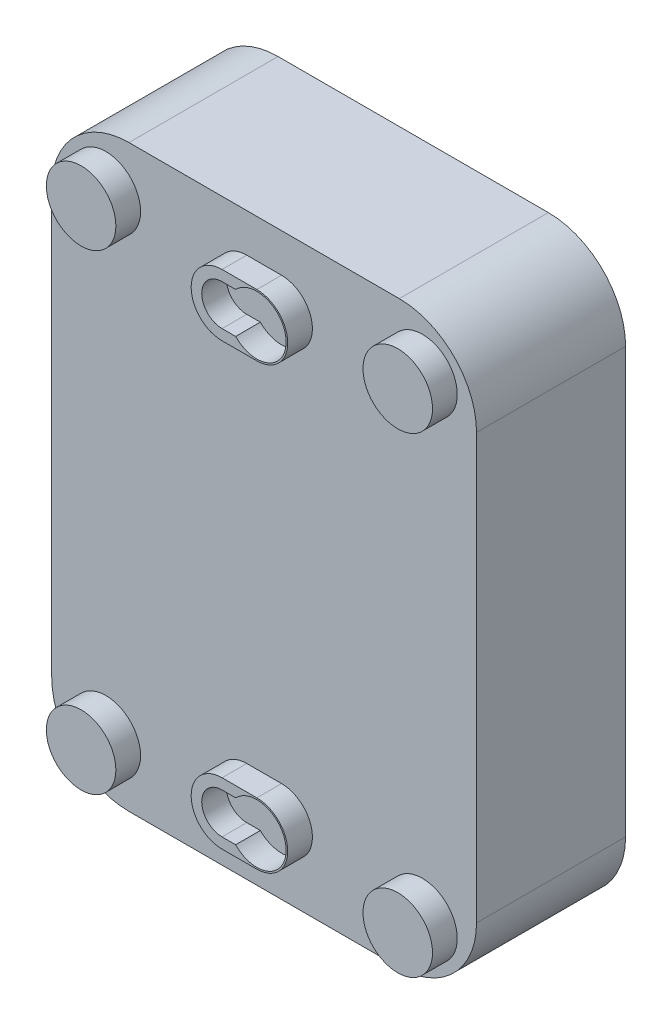
ISO-10303-21;
HEADER;
FILE_DESCRIPTION(('STEP AP214'),'2;1');
FILE_NAME('part.step','',(''),(''),'','','');
FILE_SCHEMA(('AUTOMOTIVE_DESIGN { 1 0 10303 214 1 1 1 1 }'));
ENDSEC;
DATA;
#1=APPLICATION_CONTEXT('core data for automotive mechanical design processes');
#2=APPLICATION_PROTOCOL_DEFINITION('international standard','automotive_design',2000,#1);
#3=PRODUCT_CONTEXT('',#1,'mechanical');
#4=PRODUCT('Part','Part','',(#3));
#5=PRODUCT_RELATED_PRODUCT_CATEGORY('part','',(#4));
#6=PRODUCT_DEFINITION_FORMATION('','',#4);
#7=PRODUCT_DEFINITION_CONTEXT('part definition',#1,'design');
#8=PRODUCT_DEFINITION('design','',#6,#7);
#9=PRODUCT_DEFINITION_SHAPE('','',#8);
#10=(LENGTH_UNIT() NAMED_UNIT(*) SI_UNIT(.MILLI.,.METRE.));
#11=(NAMED_UNIT(*) PLANE_ANGLE_UNIT() SI_UNIT($,.RADIAN.));
#12=(NAMED_UNIT(*) SI_UNIT($,.STERADIAN.) SOLID_ANGLE_UNIT());
#13=UNCERTAINTY_MEASURE_WITH_UNIT(LENGTH_MEASURE(1.E-05),#10,'distance_accuracy_value','');
#14=(GEOMETRIC_REPRESENTATION_CONTEXT(3) GLOBAL_UNCERTAINTY_ASSIGNED_CONTEXT((#13)) GLOBAL_UNIT_ASSIGNED_CONTEXT((#10,
#11,#12)) REPRESENTATION_CONTEXT('',''));
#15=CARTESIAN_POINT('',(0.,0.,0.));
#16=DIRECTION('',(0.,0.,1.));
#17=DIRECTION('',(1.,0.,0.));
#18=AXIS2_PLACEMENT_3D('',#15,#16,#17);
#19=CARTESIAN_POINT('',(0.,0.,28.575));
#20=DIRECTION('',(1.,0.,0.));
#21=DIRECTION('',(0.,1.,0.));
#22=AXIS2_PLACEMENT_3D('',#19,#20,#21);
#23=PLANE('',#22);
#24=DIRECTION('',(0.,-1.,0.));
#25=VECTOR('',#24,1.);
#26=CARTESIAN_POINT('',(0.,0.,24.511));
#27=LINE('',#26,#25);
#28=CARTESIAN_POINT('',(0.,82.55,24.511));
#29=VERTEX_POINT('',#28);
#30=CARTESIAN_POINT('',(0.,12.7,24.511));
#31=VERTEX_POINT('',#30);
#32=EDGE_CURVE('E361',#29,#31,#27,.T.);
#33=ORIENTED_EDGE('',*,*,#32,.F.);
#34=DIRECTION('',(0.,0.,-1.));
#35=VECTOR('',#34,1.);
#36=CARTESIAN_POINT('',(0.,82.55,28.575));
#37=LINE('',#36,#35);
#38=CARTESIAN_POINT('',(0.,82.55,0.));
#39=VERTEX_POINT('',#38);
#40=EDGE_CURVE('E401',#29,#39,#37,.T.);
#41=ORIENTED_EDGE('',*,*,#40,.T.);
#42=DIRECTION('',(0.,-1.,0.));
#43=VECTOR('',#42,1.);
#44=CARTESIAN_POINT('',(0.,0.,0.));
#45=LINE('',#44,#43);
#46=CARTESIAN_POINT('',(0.,12.7,0.));
#47=VERTEX_POINT('',#46);
#48=EDGE_CURVE('E376',#39,#47,#45,.T.);
#49=ORIENTED_EDGE('',*,*,#48,.T.);
#50=DIRECTION('',(0.,0.,-1.));
#51=VECTOR('',#50,1.);
#52=CARTESIAN_POINT('',(0.,12.7,28.575));
#53=LINE('',#52,#51);
#54=EDGE_CURVE('E403',#47,#31,#53,.F.);
#55=ORIENTED_EDGE('',*,*,#54,.T.);
#56=EDGE_LOOP('',(#33,#41,#49,#55));
#57=FACE_BOUND('',#56,.T.);
#58=ADVANCED_FACE('F37',(#57),#23,.F.);
#59=CARTESIAN_POINT('',(0.,0.,28.575));
#60=DIRECTION('',(0.,1.,0.));
#61=DIRECTION('',(0.,0.,1.));
#62=AXIS2_PLACEMENT_3D('',#59,#60,#61);
#63=PLANE('',#62);
#64=DIRECTION('',(1.,0.,0.));
#65=VECTOR('',#64,1.);
#66=CARTESIAN_POINT('',(0.,0.,24.511));
#67=LINE('',#66,#65);
#68=CARTESIAN_POINT('',(12.7,0.,24.511));
#69=VERTEX_POINT('',#68);
#70=CARTESIAN_POINT('',(57.15,0.,24.511));
#71=VERTEX_POINT('',#70);
#72=EDGE_CURVE('E371',#69,#71,#67,.T.);
#73=ORIENTED_EDGE('',*,*,#72,.F.);
#74=DIRECTION('',(0.,0.,-1.));
#75=VECTOR('',#74,1.);
#76=CARTESIAN_POINT('',(12.7,0.,28.575));
#77=LINE('',#76,#75);
#78=CARTESIAN_POINT('',(12.7,0.,0.));
#79=VERTEX_POINT('',#78);
#80=EDGE_CURVE('E391',#69,#79,#77,.T.);
#81=ORIENTED_EDGE('',*,*,#80,.T.);
#82=DIRECTION('',(1.,0.,0.));
#83=VECTOR('',#82,1.);
#84=CARTESIAN_POINT('',(0.,0.,0.));
#85=LINE('',#84,#83);
#86=CARTESIAN_POINT('',(57.15,0.,0.));
#87=VERTEX_POINT('',#86);
#88=EDGE_CURVE('E379',#79,#87,#85,.T.);
#89=ORIENTED_EDGE('',*,*,#88,.T.);
#90=DIRECTION('',(0.,0.,-1.));
#91=VECTOR('',#90,1.);
#92=CARTESIAN_POINT('',(57.15,0.,28.575));
#93=LINE('',#92,#91);
#94=EDGE_CURVE('E388',#87,#71,#93,.F.);
#95=ORIENTED_EDGE('',*,*,#94,.T.);
#96=EDGE_LOOP('',(#73,#81,#89,#95));
#97=FACE_BOUND('',#96,.T.);
#98=ADVANCED_FACE('F441',(#97),#63,.F.);
#99=CARTESIAN_POINT('',(69.85,0.,28.575));
#100=DIRECTION('',(-1.,0.,0.));
#101=DIRECTION('',(0.,-1.,0.));
#102=AXIS2_PLACEMENT_3D('',#99,#100,#101);
#103=PLANE('',#102);
#104=DIRECTION('',(0.,1.,0.));
#105=VECTOR('',#104,1.);
#106=CARTESIAN_POINT('',(69.85,0.,24.511));
#107=LINE('',#106,#105);
#108=CARTESIAN_POINT('',(69.85,12.7,24.511));
#109=VERTEX_POINT('',#108);
#110=CARTESIAN_POINT('',(69.85,82.55,24.511));
#111=VERTEX_POINT('',#110);
#112=EDGE_CURVE('E369',#109,#111,#107,.T.);
#113=ORIENTED_EDGE('',*,*,#112,.F.);
#114=DIRECTION('',(0.,0.,-1.));
#115=VECTOR('',#114,1.);
#116=CARTESIAN_POINT('',(69.85,12.7,28.575));
#117=LINE('',#116,#115);
#118=CARTESIAN_POINT('',(69.85,12.7,0.));
#119=VERTEX_POINT('',#118);
#120=EDGE_CURVE('E409',#109,#119,#117,.T.);
#121=ORIENTED_EDGE('',*,*,#120,.T.);
#122=DIRECTION('',(0.,1.,0.));
#123=VECTOR('',#122,1.);
#124=CARTESIAN_POINT('',(69.85,0.,0.));
#125=LINE('',#124,#123);
#126=CARTESIAN_POINT('',(69.85,82.55,0.));
#127=VERTEX_POINT('',#126);
#128=EDGE_CURVE('E382',#119,#127,#125,.T.);
#129=ORIENTED_EDGE('',*,*,#128,.T.);
#130=DIRECTION('',(0.,0.,-1.));
#131=VECTOR('',#130,1.);
#132=CARTESIAN_POINT('',(69.85,82.55,28.575));
#133=LINE('',#132,#131);
#134=EDGE_CURVE('E406',#127,#111,#133,.F.);
#135=ORIENTED_EDGE('',*,*,#134,.T.);
#136=EDGE_LOOP('',(#113,#121,#129,#135));
#137=FACE_BOUND('',#136,.T.);
#138=ADVANCED_FACE('F449',(#137),#103,.F.);
#139=CARTESIAN_POINT('',(0.,95.25,28.575));
#140=DIRECTION('',(0.,-1.,0.));
#141=DIRECTION('',(0.,0.,-1.));
#142=AXIS2_PLACEMENT_3D('',#139,#140,#141);
#143=PLANE('',#142);
#144=DIRECTION('',(-1.,0.,0.));
#145=VECTOR('',#144,1.);
#146=CARTESIAN_POINT('',(0.,95.25,24.511));
#147=LINE('',#146,#145);
#148=CARTESIAN_POINT('',(57.15,95.25,24.511));
#149=VERTEX_POINT('',#148);
#150=CARTESIAN_POINT('',(12.7,95.25,24.511));
#151=VERTEX_POINT('',#150);
#152=EDGE_CURVE('E353',#149,#151,#147,.T.);
#153=ORIENTED_EDGE('',*,*,#152,.F.);
#154=DIRECTION('',(0.,0.,-1.));
#155=VECTOR('',#154,1.);
#156=CARTESIAN_POINT('',(57.15,95.25,28.575));
#157=LINE('',#156,#155);
#158=CARTESIAN_POINT('',(57.15,95.25,0.));
#159=VERTEX_POINT('',#158);
#160=EDGE_CURVE('E45',#149,#159,#157,.T.);
#161=ORIENTED_EDGE('',*,*,#160,.T.);
#162=DIRECTION('',(-1.,0.,0.));
#163=VECTOR('',#162,1.);
#164=CARTESIAN_POINT('',(0.,95.25,0.));
#165=LINE('',#164,#163);
#166=CARTESIAN_POINT('',(12.7,95.25,0.));
#167=VERTEX_POINT('',#166);
#168=EDGE_CURVE('E385',#159,#167,#165,.T.);
#169=ORIENTED_EDGE('',*,*,#168,.T.);
#170=DIRECTION('',(0.,0.,-1.));
#171=VECTOR('',#170,1.);
#172=CARTESIAN_POINT('',(12.7,95.25,28.575));
#173=LINE('',#172,#171);
#174=EDGE_CURVE('E411',#167,#151,#173,.F.);
#175=ORIENTED_EDGE('',*,*,#174,.T.);
#176=EDGE_LOOP('',(#153,#161,#169,#175));
#177=FACE_BOUND('',#176,.T.);
#178=ADVANCED_FACE('F417',(#177),#143,.F.);
#179=CARTESIAN_POINT('',(12.7,12.7,28.575));
#180=DIRECTION('',(0.,0.,-1.));
#181=DIRECTION('',(-1.,0.,0.));
#182=AXIS2_PLACEMENT_3D('',#179,#180,#181);
#183=CYLINDRICAL_SURFACE('',#182,12.7);
#184=ORIENTED_EDGE('',*,*,#80,.F.);
#185=CARTESIAN_POINT('',(12.7,12.7,24.511));
#186=DIRECTION('',(0.,0.,1.));
#187=DIRECTION('',(1.,0.,0.));
#188=AXIS2_PLACEMENT_3D('',#185,#186,#187);
#189=CIRCLE('',#188,12.7);
#190=EDGE_CURVE('E366',#69,#31,#189,.F.);
#191=ORIENTED_EDGE('',*,*,#190,.T.);
#192=ORIENTED_EDGE('',*,*,#54,.F.);
#193=CARTESIAN_POINT('',(12.7,12.7,0.));
#194=DIRECTION('',(0.,0.,-1.));
#195=DIRECTION('',(-1.,0.,0.));
#196=AXIS2_PLACEMENT_3D('',#193,#194,#195);
#197=CIRCLE('',#196,12.7);
#198=EDGE_CURVE('E399',#79,#47,#197,.T.);
#199=ORIENTED_EDGE('',*,*,#198,.F.);
#200=EDGE_LOOP('',(#184,#191,#192,#199));
#201=FACE_BOUND('',#200,.T.);
#202=ADVANCED_FACE('F438',(#201),#183,.T.);
#203=CARTESIAN_POINT('',(57.15,12.7,28.575));
#204=DIRECTION('',(0.,0.,-1.));
#205=DIRECTION('',(-1.,0.,0.));
#206=AXIS2_PLACEMENT_3D('',#203,#204,#205);
#207=CYLINDRICAL_SURFACE('',#206,12.7);
#208=ORIENTED_EDGE('',*,*,#120,.F.);
#209=CARTESIAN_POINT('',(57.15,12.7,24.511));
#210=DIRECTION('',(0.,0.,1.));
#211=DIRECTION('',(1.,0.,0.));
#212=AXIS2_PLACEMENT_3D('',#209,#210,#211);
#213=CIRCLE('',#212,12.7);
#214=EDGE_CURVE('E373',#109,#71,#213,.F.);
#215=ORIENTED_EDGE('',*,*,#214,.T.);
#216=ORIENTED_EDGE('',*,*,#94,.F.);
#217=CARTESIAN_POINT('',(57.15,12.7,0.));
#218=DIRECTION('',(0.,0.,-1.));
#219=DIRECTION('',(-1.,0.,0.));
#220=AXIS2_PLACEMENT_3D('',#217,#218,#219);
#221=CIRCLE('',#220,12.7);
#222=EDGE_CURVE('E397',#119,#87,#221,.T.);
#223=ORIENTED_EDGE('',*,*,#222,.F.);
#224=EDGE_LOOP('',(#208,#215,#216,#223));
#225=FACE_BOUND('',#224,.T.);
#226=ADVANCED_FACE('F446',(#225),#207,.T.);
#227=CARTESIAN_POINT('',(57.15,82.55,28.575));
#228=DIRECTION('',(0.,0.,-1.));
#229=DIRECTION('',(-1.,0.,0.));
#230=AXIS2_PLACEMENT_3D('',#227,#228,#229);
#231=CYLINDRICAL_SURFACE('',#230,12.7);
#232=ORIENTED_EDGE('',*,*,#160,.F.);
#233=CARTESIAN_POINT('',(57.15,82.55,24.511));
#234=DIRECTION('',(0.,0.,1.));
#235=DIRECTION('',(1.,0.,0.));
#236=AXIS2_PLACEMENT_3D('',#233,#234,#235);
#237=CIRCLE('',#236,12.7);
#238=EDGE_CURVE('E363',#149,#111,#237,.F.);
#239=ORIENTED_EDGE('',*,*,#238,.T.);
#240=ORIENTED_EDGE('',*,*,#134,.F.);
#241=CARTESIAN_POINT('',(57.15,82.55,0.));
#242=DIRECTION('',(0.,0.,-1.));
#243=DIRECTION('',(-1.,0.,0.));
#244=AXIS2_PLACEMENT_3D('',#241,#242,#243);
#245=CIRCLE('',#244,12.7);
#246=EDGE_CURVE('E395',#159,#127,#245,.T.);
#247=ORIENTED_EDGE('',*,*,#246,.F.);
#248=EDGE_LOOP('',(#232,#239,#240,#247));
#249=FACE_BOUND('',#248,.T.);
#250=ADVANCED_FACE('F422',(#249),#231,.T.);
#251=CARTESIAN_POINT('',(12.7,82.55,28.575));
#252=DIRECTION('',(0.,0.,-1.));
#253=DIRECTION('',(-1.,0.,0.));
#254=AXIS2_PLACEMENT_3D('',#251,#252,#253);
#255=CYLINDRICAL_SURFACE('',#254,12.7);
#256=ORIENTED_EDGE('',*,*,#40,.F.);
#257=CARTESIAN_POINT('',(12.7,82.55,24.511));
#258=DIRECTION('',(0.,0.,1.));
#259=DIRECTION('',(1.,0.,0.));
#260=AXIS2_PLACEMENT_3D('',#257,#258,#259);
#261=CIRCLE('',#260,12.7);
#262=EDGE_CURVE('E12',#29,#151,#261,.F.);
#263=ORIENTED_EDGE('',*,*,#262,.T.);
#264=ORIENTED_EDGE('',*,*,#174,.F.);
#265=CARTESIAN_POINT('',(12.7,82.55,0.));
#266=DIRECTION('',(0.,0.,-1.));
#267=DIRECTION('',(-1.,0.,0.));
#268=AXIS2_PLACEMENT_3D('',#265,#266,#267);
#269=CIRCLE('',#268,12.7);
#270=EDGE_CURVE('E393',#39,#167,#269,.T.);
#271=ORIENTED_EDGE('',*,*,#270,.F.);
#272=EDGE_LOOP('',(#256,#263,#264,#271));
#273=FACE_BOUND('',#272,.T.);
#274=ADVANCED_FACE('F39',(#273),#255,.T.);
#275=CARTESIAN_POINT('',(0.,0.,0.));
#276=DIRECTION('',(0.,0.,-1.));
#277=DIRECTION('',(-1.,0.,0.));
#278=AXIS2_PLACEMENT_3D('',#275,#276,#277);
#279=PLANE('',#278);
#280=ORIENTED_EDGE('',*,*,#88,.F.);
#281=ORIENTED_EDGE('',*,*,#198,.T.);
#282=ORIENTED_EDGE('',*,*,#48,.F.);
#283=ORIENTED_EDGE('',*,*,#270,.T.);
#284=ORIENTED_EDGE('',*,*,#168,.F.);
#285=ORIENTED_EDGE('',*,*,#246,.T.);
#286=ORIENTED_EDGE('',*,*,#128,.F.);
#287=ORIENTED_EDGE('',*,*,#222,.T.);
#288=EDGE_LOOP('',(#280,#281,#282,#283,#284,#285,#286,#287));
#289=FACE_BOUND('',#288,.T.);
#290=ADVANCED_FACE('F426',(#289),#279,.T.);
#291=CARTESIAN_POINT('',(34.925,47.625,24.511));
#292=DIRECTION('',(0.,0.,1.));
#293=DIRECTION('',(1.,0.,0.));
#294=AXIS2_PLACEMENT_3D('',#291,#292,#293);
#295=PLANE('',#294);
#296=ORIENTED_EDGE('',*,*,#112,.T.);
#297=ORIENTED_EDGE('',*,*,#238,.F.);
#298=ORIENTED_EDGE('',*,*,#152,.T.);
#299=ORIENTED_EDGE('',*,*,#262,.F.);
#300=ORIENTED_EDGE('',*,*,#32,.T.);
#301=ORIENTED_EDGE('',*,*,#190,.F.);
#302=ORIENTED_EDGE('',*,*,#72,.T.);
#303=ORIENTED_EDGE('',*,*,#214,.F.);
#304=EDGE_LOOP('',(#296,#297,#298,#299,#300,#301,#302,#303));
#305=FACE_BOUND('',#304,.T.);
#306=DIRECTION('',(1.,0.,0.));
#307=VECTOR('',#306,1.);
#308=CARTESIAN_POINT('',(37.7825,78.74,24.511));
#309=LINE('',#308,#307);
#310=CARTESIAN_POINT('',(32.0675,78.74,24.511));
#311=VERTEX_POINT('',#310);
#312=CARTESIAN_POINT('',(37.7825,78.74,24.511));
#313=VERTEX_POINT('',#312);
#314=EDGE_CURVE('E211',#311,#313,#309,.T.);
#315=ORIENTED_EDGE('',*,*,#314,.F.);
#316=CARTESIAN_POINT('',(32.0675,83.82,24.511));
#317=DIRECTION('',(0.,0.,1.));
#318=DIRECTION('',(-1.,0.,0.));
#319=AXIS2_PLACEMENT_3D('',#316,#317,#318);
#320=CIRCLE('',#319,5.08);
#321=CARTESIAN_POINT('',(32.0675,88.9,24.511));
#322=VERTEX_POINT('',#321);
#323=EDGE_CURVE('E221',#322,#311,#320,.T.);
#324=ORIENTED_EDGE('',*,*,#323,.F.);
#325=DIRECTION('',(-1.,0.,0.));
#326=VECTOR('',#325,1.);
#327=CARTESIAN_POINT('',(37.7825,88.9,24.511));
#328=LINE('',#327,#326);
#329=CARTESIAN_POINT('',(37.7825,88.9,24.511));
#330=VERTEX_POINT('',#329);
#331=EDGE_CURVE('E203',#330,#322,#328,.T.);
#332=ORIENTED_EDGE('',*,*,#331,.F.);
#333=CARTESIAN_POINT('',(37.7825,83.82,24.511));
#334=DIRECTION('',(0.,0.,1.));
#335=DIRECTION('',(-1.,0.,0.));
#336=AXIS2_PLACEMENT_3D('',#333,#334,#335);
#337=CIRCLE('',#336,5.08);
#338=EDGE_CURVE('E218',#313,#330,#337,.T.);
#339=ORIENTED_EDGE('',*,*,#338,.F.);
#340=EDGE_LOOP('',(#315,#324,#332,#339));
#341=FACE_BOUND('',#340,.T.);
#342=DIRECTION('',(1.,0.,0.));
#343=VECTOR('',#342,1.);
#344=CARTESIAN_POINT('',(37.7825,6.35,24.511));
#345=LINE('',#344,#343);
#346=CARTESIAN_POINT('',(32.0675,6.35,24.511));
#347=VERTEX_POINT('',#346);
#348=CARTESIAN_POINT('',(37.7825,6.35,24.511));
#349=VERTEX_POINT('',#348);
#350=EDGE_CURVE('E254',#347,#349,#345,.T.);
#351=ORIENTED_EDGE('',*,*,#350,.F.);
#352=CARTESIAN_POINT('',(32.0675,11.43,24.511));
#353=DIRECTION('',(0.,0.,1.));
#354=DIRECTION('',(1.,0.,0.));
#355=AXIS2_PLACEMENT_3D('',#352,#353,#354);
#356=CIRCLE('',#355,5.08);
#357=CARTESIAN_POINT('',(32.0675,16.51,24.511));
#358=VERTEX_POINT('',#357);
#359=EDGE_CURVE('E251',#358,#347,#356,.T.);
#360=ORIENTED_EDGE('',*,*,#359,.F.);
#361=DIRECTION('',(-1.,0.,0.));
#362=VECTOR('',#361,1.);
#363=CARTESIAN_POINT('',(37.7825,16.51,24.511));
#364=LINE('',#363,#362);
#365=CARTESIAN_POINT('',(37.7825,16.51,24.511));
#366=VERTEX_POINT('',#365);
#367=EDGE_CURVE('E247',#366,#358,#364,.T.);
#368=ORIENTED_EDGE('',*,*,#367,.F.);
#369=CARTESIAN_POINT('',(37.7825,11.43,24.511));
#370=DIRECTION('',(0.,0.,1.));
#371=DIRECTION('',(1.,0.,0.));
#372=AXIS2_PLACEMENT_3D('',#369,#370,#371);
#373=CIRCLE('',#372,5.08);
#374=EDGE_CURVE('E244',#349,#366,#373,.T.);
#375=ORIENTED_EDGE('',*,*,#374,.F.);
#376=EDGE_LOOP('',(#351,#360,#368,#375));
#377=FACE_BOUND('',#376,.T.);
#378=CARTESIAN_POINT('',(60.96,86.36,24.511));
#379=DIRECTION('',(0.,0.,1.));
#380=DIRECTION('',(1.,0.,0.));
#381=AXIS2_PLACEMENT_3D('',#378,#379,#380);
#382=CIRCLE('',#381,5.71499999999998);
#383=CARTESIAN_POINT('',(66.675,86.36,24.511));
#384=VERTEX_POINT('',#383);
#385=EDGE_CURVE('E274',#384,#384,#382,.T.);
#386=ORIENTED_EDGE('',*,*,#385,.F.);
#387=EDGE_LOOP('',(#386));
#388=FACE_BOUND('',#387,.T.);
#389=CARTESIAN_POINT('',(8.88999999999997,86.36,24.511));
#390=DIRECTION('',(0.,0.,1.));
#391=DIRECTION('',(1.,0.,0.));
#392=AXIS2_PLACEMENT_3D('',#389,#390,#391);
#393=CIRCLE('',#392,5.715);
#394=CARTESIAN_POINT('',(14.605,86.36,24.511));
#395=VERTEX_POINT('',#394);
#396=EDGE_CURVE('E280',#395,#395,#393,.T.);
#397=ORIENTED_EDGE('',*,*,#396,.F.);
#398=EDGE_LOOP('',(#397));
#399=FACE_BOUND('',#398,.T.);
#400=CARTESIAN_POINT('',(8.88999999999997,8.89,24.511));
#401=DIRECTION('',(0.,0.,1.));
#402=DIRECTION('',(1.,0.,0.));
#403=AXIS2_PLACEMENT_3D('',#400,#401,#402);
#404=CIRCLE('',#403,5.715);
#405=CARTESIAN_POINT('',(14.605,8.89,24.511));
#406=VERTEX_POINT('',#405);
#407=EDGE_CURVE('E286',#406,#406,#404,.T.);
#408=ORIENTED_EDGE('',*,*,#407,.F.);
#409=EDGE_LOOP('',(#408));
#410=FACE_BOUND('',#409,.T.);
#411=CARTESIAN_POINT('',(60.96,8.89,24.511));
#412=DIRECTION('',(0.,0.,1.));
#413=DIRECTION('',(1.,0.,0.));
#414=AXIS2_PLACEMENT_3D('',#411,#412,#413);
#415=CIRCLE('',#414,5.71499999999999);
#416=CARTESIAN_POINT('',(66.675,8.89,24.511));
#417=VERTEX_POINT('',#416);
#418=EDGE_CURVE('E292',#417,#417,#415,.T.);
#419=ORIENTED_EDGE('',*,*,#418,.F.);
#420=EDGE_LOOP('',(#419));
#421=FACE_BOUND('',#420,.T.);
#422=ADVANCED_FACE('F216',(#305,#341,#377,#388,#399,#410,#421),#295,.T.);
#423=CARTESIAN_POINT('',(60.96,8.89,24.511));
#424=DIRECTION('',(0.,0.,1.));
#425=DIRECTION('',(1.,0.,0.));
#426=AXIS2_PLACEMENT_3D('',#423,#424,#425);
#427=CYLINDRICAL_SURFACE('',#426,5.71499999999999);
#428=ORIENTED_EDGE('',*,*,#418,.T.);
#429=EDGE_LOOP('',(#428));
#430=FACE_BOUND('',#429,.T.);
#431=CARTESIAN_POINT('',(60.96,8.89,28.575));
#432=DIRECTION('',(0.,0.,1.));
#433=DIRECTION('',(1.,0.,0.));
#434=AXIS2_PLACEMENT_3D('',#431,#432,#433);
#435=CIRCLE('',#434,5.71499999999999);
#436=CARTESIAN_POINT('',(66.675,8.89,28.575));
#437=VERTEX_POINT('',#436);
#438=EDGE_CURVE('E289',#437,#437,#435,.T.);
#439=ORIENTED_EDGE('',*,*,#438,.F.);
#440=EDGE_LOOP('',(#439));
#441=FACE_BOUND('',#440,.T.);
#442=ADVANCED_FACE('F477',(#430,#441),#427,.T.);
#443=CARTESIAN_POINT('',(8.88999999999997,8.89,24.511));
#444=DIRECTION('',(0.,0.,1.));
#445=DIRECTION('',(1.,0.,0.));
#446=AXIS2_PLACEMENT_3D('',#443,#444,#445);
#447=CYLINDRICAL_SURFACE('',#446,5.715);
#448=ORIENTED_EDGE('',*,*,#407,.T.);
#449=EDGE_LOOP('',(#448));
#450=FACE_BOUND('',#449,.T.);
#451=CARTESIAN_POINT('',(8.88999999999997,8.89,28.575));
#452=DIRECTION('',(0.,0.,1.));
#453=DIRECTION('',(1.,0.,0.));
#454=AXIS2_PLACEMENT_3D('',#451,#452,#453);
#455=CIRCLE('',#454,5.715);
#456=CARTESIAN_POINT('',(14.605,8.89,28.575));
#457=VERTEX_POINT('',#456);
#458=EDGE_CURVE('E283',#457,#457,#455,.T.);
#459=ORIENTED_EDGE('',*,*,#458,.F.);
#460=EDGE_LOOP('',(#459));
#461=FACE_BOUND('',#460,.T.);
#462=ADVANCED_FACE('F528',(#450,#461),#447,.T.);
#463=CARTESIAN_POINT('',(8.88999999999997,86.36,24.511));
#464=DIRECTION('',(0.,0.,1.));
#465=DIRECTION('',(1.,0.,0.));
#466=AXIS2_PLACEMENT_3D('',#463,#464,#465);
#467=CYLINDRICAL_SURFACE('',#466,5.715);
#468=ORIENTED_EDGE('',*,*,#396,.T.);
#469=EDGE_LOOP('',(#468));
#470=FACE_BOUND('',#469,.T.);
#471=CARTESIAN_POINT('',(8.88999999999997,86.36,28.575));
#472=DIRECTION('',(0.,0.,1.));
#473=DIRECTION('',(1.,0.,0.));
#474=AXIS2_PLACEMENT_3D('',#471,#472,#473);
#475=CIRCLE('',#474,5.715);
#476=CARTESIAN_POINT('',(14.605,86.36,28.575));
#477=VERTEX_POINT('',#476);
#478=EDGE_CURVE('E277',#477,#477,#475,.T.);
#479=ORIENTED_EDGE('',*,*,#478,.F.);
#480=EDGE_LOOP('',(#479));
#481=FACE_BOUND('',#480,.T.);
#482=ADVANCED_FACE('F532',(#470,#481),#467,.T.);
#483=CARTESIAN_POINT('',(60.96,86.36,24.511));
#484=DIRECTION('',(0.,0.,1.));
#485=DIRECTION('',(1.,0.,0.));
#486=AXIS2_PLACEMENT_3D('',#483,#484,#485);
#487=CYLINDRICAL_SURFACE('',#486,5.71499999999998);
#488=ORIENTED_EDGE('',*,*,#385,.T.);
#489=EDGE_LOOP('',(#488));
#490=FACE_BOUND('',#489,.T.);
#491=CARTESIAN_POINT('',(60.96,86.36,28.575));
#492=DIRECTION('',(0.,0.,1.));
#493=DIRECTION('',(1.,0.,0.));
#494=AXIS2_PLACEMENT_3D('',#491,#492,#493);
#495=CIRCLE('',#494,5.71499999999998);
#496=CARTESIAN_POINT('',(66.675,86.36,28.575));
#497=VERTEX_POINT('',#496);
#498=EDGE_CURVE('E268',#497,#497,#495,.T.);
#499=ORIENTED_EDGE('',*,*,#498,.F.);
#500=EDGE_LOOP('',(#499));
#501=FACE_BOUND('',#500,.T.);
#502=ADVANCED_FACE('F536',(#490,#501),#487,.T.);
#503=CARTESIAN_POINT('',(37.7825,11.43,24.511));
#504=DIRECTION('',(0.,0.,1.));
#505=DIRECTION('',(1.,0.,0.));
#506=AXIS2_PLACEMENT_3D('',#503,#504,#505);
#507=CYLINDRICAL_SURFACE('',#506,5.08);
#508=CARTESIAN_POINT('',(37.7825,11.43,28.575));
#509=DIRECTION('',(0.,0.,1.));
#510=DIRECTION('',(1.,0.,0.));
#511=AXIS2_PLACEMENT_3D('',#508,#509,#510);
#512=CIRCLE('',#511,5.08);
#513=CARTESIAN_POINT('',(37.7825,6.35,28.575));
#514=VERTEX_POINT('',#513);
#515=CARTESIAN_POINT('',(37.7825,16.51,28.575));
#516=VERTEX_POINT('',#515);
#517=EDGE_CURVE('E240',#514,#516,#512,.T.);
#518=ORIENTED_EDGE('',*,*,#517,.F.);
#519=DIRECTION('',(0.,0.,1.));
#520=VECTOR('',#519,1.);
#521=CARTESIAN_POINT('',(37.7825,6.35,24.511));
#522=LINE('',#521,#520);
#523=EDGE_CURVE('E266',#349,#514,#522,.T.);
#524=ORIENTED_EDGE('',*,*,#523,.F.);
#525=ORIENTED_EDGE('',*,*,#374,.T.);
#526=DIRECTION('',(0.,0.,1.));
#527=VECTOR('',#526,1.);
#528=CARTESIAN_POINT('',(37.7825,16.51,24.511));
#529=LINE('',#528,#527);
#530=EDGE_CURVE('E257',#366,#516,#529,.T.);
#531=ORIENTED_EDGE('',*,*,#530,.T.);
#532=EDGE_LOOP('',(#518,#524,#525,#531));
#533=FACE_BOUND('',#532,.T.);
#534=ADVANCED_FACE('F540',(#533),#507,.T.);
#535=CARTESIAN_POINT('',(37.7825,6.35,24.511));
#536=DIRECTION('',(0.,-1.,0.));
#537=DIRECTION('',(0.,0.,-1.));
#538=AXIS2_PLACEMENT_3D('',#535,#536,#537);
#539=PLANE('',#538);
#540=DIRECTION('',(1.,0.,0.));
#541=VECTOR('',#540,1.);
#542=CARTESIAN_POINT('',(37.7825,6.35,28.575));
#543=LINE('',#542,#541);
#544=CARTESIAN_POINT('',(32.0675,6.35,28.575));
#545=VERTEX_POINT('',#544);
#546=EDGE_CURVE('E248',#545,#514,#543,.T.);
#547=ORIENTED_EDGE('',*,*,#546,.F.);
#548=DIRECTION('',(0.,0.,1.));
#549=VECTOR('',#548,1.);
#550=CARTESIAN_POINT('',(32.0675,6.35,24.511));
#551=LINE('',#550,#549);
#552=EDGE_CURVE('E269',#347,#545,#551,.T.);
#553=ORIENTED_EDGE('',*,*,#552,.F.);
#554=ORIENTED_EDGE('',*,*,#350,.T.);
#555=ORIENTED_EDGE('',*,*,#523,.T.);
#556=EDGE_LOOP('',(#547,#553,#554,#555));
#557=FACE_BOUND('',#556,.T.);
#558=ADVANCED_FACE('F544',(#557),#539,.T.);
#559=CARTESIAN_POINT('',(32.0675,11.43,24.511));
#560=DIRECTION('',(0.,0.,1.));
#561=DIRECTION('',(1.,0.,0.));
#562=AXIS2_PLACEMENT_3D('',#559,#560,#561);
#563=CYLINDRICAL_SURFACE('',#562,5.08);
#564=CARTESIAN_POINT('',(32.0675,11.43,28.575));
#565=DIRECTION('',(0.,0.,1.));
#566=DIRECTION('',(1.,0.,0.));
#567=AXIS2_PLACEMENT_3D('',#564,#565,#566);
#568=CIRCLE('',#567,5.08);
#569=CARTESIAN_POINT('',(32.0675,16.51,28.575));
#570=VERTEX_POINT('',#569);
#571=EDGE_CURVE('E60',#570,#545,#568,.T.);
#572=ORIENTED_EDGE('',*,*,#571,.F.);
#573=DIRECTION('',(0.,0.,1.));
#574=VECTOR('',#573,1.);
#575=CARTESIAN_POINT('',(32.0675,16.51,24.511));
#576=LINE('',#575,#574);
#577=EDGE_CURVE('E271',#358,#570,#576,.T.);
#578=ORIENTED_EDGE('',*,*,#577,.F.);
#579=ORIENTED_EDGE('',*,*,#359,.T.);
#580=ORIENTED_EDGE('',*,*,#552,.T.);
#581=EDGE_LOOP('',(#572,#578,#579,#580));
#582=FACE_BOUND('',#581,.T.);
#583=ADVANCED_FACE('F549',(#582),#563,.T.);
#584=CARTESIAN_POINT('',(37.7825,16.51,24.511));
#585=DIRECTION('',(0.,1.,0.));
#586=DIRECTION('',(0.,0.,1.));
#587=AXIS2_PLACEMENT_3D('',#584,#585,#586);
#588=PLANE('',#587);
#589=DIRECTION('',(-1.,0.,0.));
#590=VECTOR('',#589,1.);
#591=CARTESIAN_POINT('',(37.7825,16.51,28.575));
#592=LINE('',#591,#590);
#593=EDGE_CURVE('E260',#516,#570,#592,.T.);
#594=ORIENTED_EDGE('',*,*,#593,.F.);
#595=ORIENTED_EDGE('',*,*,#530,.F.);
#596=ORIENTED_EDGE('',*,*,#367,.T.);
#597=ORIENTED_EDGE('',*,*,#577,.T.);
#598=EDGE_LOOP('',(#594,#595,#596,#597));
#599=FACE_BOUND('',#598,.T.);
#600=ADVANCED_FACE('F546',(#599),#588,.T.);
#601=CARTESIAN_POINT('',(37.7825,83.82,24.511));
#602=DIRECTION('',(0.,0.,1.));
#603=DIRECTION('',(1.,0.,0.));
#604=AXIS2_PLACEMENT_3D('',#601,#602,#603);
#605=CYLINDRICAL_SURFACE('',#604,5.08);
#606=CARTESIAN_POINT('',(37.7825,83.82,28.575));
#607=DIRECTION('',(0.,0.,1.));
#608=DIRECTION('',(-1.,0.,0.));
#609=AXIS2_PLACEMENT_3D('',#606,#607,#608);
#610=CIRCLE('',#609,5.08);
#611=CARTESIAN_POINT('',(37.7825,78.74,28.575));
#612=VERTEX_POINT('',#611);
#613=CARTESIAN_POINT('',(37.7825,88.9,28.575));
#614=VERTEX_POINT('',#613);
#615=EDGE_CURVE('E234',#612,#614,#610,.T.);
#616=ORIENTED_EDGE('',*,*,#615,.F.);
#617=DIRECTION('',(0.,0.,1.));
#618=VECTOR('',#617,1.);
#619=CARTESIAN_POINT('',(37.7825,78.74,24.511));
#620=LINE('',#619,#618);
#621=EDGE_CURVE('E225',#313,#612,#620,.T.);
#622=ORIENTED_EDGE('',*,*,#621,.F.);
#623=ORIENTED_EDGE('',*,*,#338,.T.);
#624=DIRECTION('',(0.,0.,1.));
#625=VECTOR('',#624,1.);
#626=CARTESIAN_POINT('',(37.7825,88.9,24.511));
#627=LINE('',#626,#625);
#628=EDGE_CURVE('E199',#330,#614,#627,.T.);
#629=ORIENTED_EDGE('',*,*,#628,.T.);
#630=EDGE_LOOP('',(#616,#622,#623,#629));
#631=FACE_BOUND('',#630,.T.);
#632=ADVANCED_FACE('F224',(#631),#605,.T.);
#633=CARTESIAN_POINT('',(37.7825,78.74,24.511));
#634=DIRECTION('',(0.,-1.,0.));
#635=DIRECTION('',(0.,0.,-1.));
#636=AXIS2_PLACEMENT_3D('',#633,#634,#635);
#637=PLANE('',#636);
#638=DIRECTION('',(1.,0.,0.));
#639=VECTOR('',#638,1.);
#640=CARTESIAN_POINT('',(37.7825,78.74,28.575));
#641=LINE('',#640,#639);
#642=CARTESIAN_POINT('',(32.0675,78.74,28.575));
#643=VERTEX_POINT('',#642);
#644=EDGE_CURVE('E226',#643,#612,#641,.T.);
#645=ORIENTED_EDGE('',*,*,#644,.F.);
#646=DIRECTION('',(0.,0.,1.));
#647=VECTOR('',#646,1.);
#648=CARTESIAN_POINT('',(32.0675,78.74,24.511));
#649=LINE('',#648,#647);
#650=EDGE_CURVE('E241',#311,#643,#649,.T.);
#651=ORIENTED_EDGE('',*,*,#650,.F.);
#652=ORIENTED_EDGE('',*,*,#314,.T.);
#653=ORIENTED_EDGE('',*,*,#621,.T.);
#654=EDGE_LOOP('',(#645,#651,#652,#653));
#655=FACE_BOUND('',#654,.T.);
#656=ADVANCED_FACE('F558',(#655),#637,.T.);
#657=CARTESIAN_POINT('',(32.0675,83.82,24.511));
#658=DIRECTION('',(0.,0.,1.));
#659=DIRECTION('',(1.,0.,0.));
#660=AXIS2_PLACEMENT_3D('',#657,#658,#659);
#661=CYLINDRICAL_SURFACE('',#660,5.08);
#662=CARTESIAN_POINT('',(32.0675,83.82,28.575));
#663=DIRECTION('',(0.,0.,1.));
#664=DIRECTION('',(-1.,0.,0.));
#665=AXIS2_PLACEMENT_3D('',#662,#663,#664);
#666=CIRCLE('',#665,5.08);
#667=CARTESIAN_POINT('',(32.0675,88.9,28.575));
#668=VERTEX_POINT('',#667);
#669=EDGE_CURVE('E229',#668,#643,#666,.T.);
#670=ORIENTED_EDGE('',*,*,#669,.F.);
#671=DIRECTION('',(0.,0.,1.));
#672=VECTOR('',#671,1.);
#673=CARTESIAN_POINT('',(32.0675,88.9,24.511));
#674=LINE('',#673,#672);
#675=EDGE_CURVE('E210',#322,#668,#674,.T.);
#676=ORIENTED_EDGE('',*,*,#675,.F.);
#677=ORIENTED_EDGE('',*,*,#323,.T.);
#678=ORIENTED_EDGE('',*,*,#650,.T.);
#679=EDGE_LOOP('',(#670,#676,#677,#678));
#680=FACE_BOUND('',#679,.T.);
#681=ADVANCED_FACE('F561',(#680),#661,.T.);
#682=CARTESIAN_POINT('',(37.7825,88.9,24.511));
#683=DIRECTION('',(0.,1.,0.));
#684=DIRECTION('',(0.,0.,1.));
#685=AXIS2_PLACEMENT_3D('',#682,#683,#684);
#686=PLANE('',#685);
#687=DIRECTION('',(-1.,0.,0.));
#688=VECTOR('',#687,1.);
#689=CARTESIAN_POINT('',(37.7825,88.9,28.575));
#690=LINE('',#689,#688);
#691=EDGE_CURVE('E205',#614,#668,#690,.T.);
#692=ORIENTED_EDGE('',*,*,#691,.F.);
#693=ORIENTED_EDGE('',*,*,#628,.F.);
#694=ORIENTED_EDGE('',*,*,#331,.T.);
#695=ORIENTED_EDGE('',*,*,#675,.T.);
#696=EDGE_LOOP('',(#692,#693,#694,#695));
#697=FACE_BOUND('',#696,.T.);
#698=ADVANCED_FACE('F201',(#697),#686,.T.);
#699=CARTESIAN_POINT('',(0.,0.,28.575));
#700=DIRECTION('',(0.,0.,-1.));
#701=DIRECTION('',(-1.,0.,0.));
#702=AXIS2_PLACEMENT_3D('',#699,#700,#701);
#703=PLANE('',#702);
#704=DIRECTION('',(-1.,0.,0.));
#705=VECTOR('',#704,1.);
#706=CARTESIAN_POINT('',(32.0675,87.1628200604965,28.575));
#707=LINE('',#706,#705);
#708=CARTESIAN_POINT('',(34.3017199088219,87.1628200604965,28.575));
#709=VERTEX_POINT('',#708);
#710=CARTESIAN_POINT('',(32.0675,87.1628200604965,28.575));
#711=VERTEX_POINT('',#710);
#712=EDGE_CURVE('E343',#709,#711,#707,.T.);
#713=ORIENTED_EDGE('',*,*,#712,.F.);
#714=CARTESIAN_POINT('',(37.7825,83.82,28.575));
#715=DIRECTION('',(0.,0.,1.));
#716=DIRECTION('',(1.,0.,0.));
#717=AXIS2_PLACEMENT_3D('',#714,#715,#716);
#718=CIRCLE('',#717,4.82599999999999);
#719=CARTESIAN_POINT('',(34.3017199088219,80.4771799395034,28.575));
#720=VERTEX_POINT('',#719);
#721=EDGE_CURVE('E322',#720,#709,#718,.T.);
#722=ORIENTED_EDGE('',*,*,#721,.F.);
#723=DIRECTION('',(1.,0.,0.));
#724=VECTOR('',#723,1.);
#725=CARTESIAN_POINT('',(32.0675,80.4771799395034,28.575));
#726=LINE('',#725,#724);
#727=CARTESIAN_POINT('',(32.0675,80.4771799395034,28.575));
#728=VERTEX_POINT('',#727);
#729=EDGE_CURVE('E332',#728,#720,#726,.T.);
#730=ORIENTED_EDGE('',*,*,#729,.F.);
#731=CARTESIAN_POINT('',(32.0675,83.82,28.575));
#732=DIRECTION('',(0.,0.,1.));
#733=DIRECTION('',(1.,0.,0.));
#734=AXIS2_PLACEMENT_3D('',#731,#732,#733);
#735=CIRCLE('',#734,3.34282006049655);
#736=EDGE_CURVE('E346',#711,#728,#735,.T.);
#737=ORIENTED_EDGE('',*,*,#736,.F.);
#738=EDGE_LOOP('',(#713,#722,#730,#737));
#739=FACE_BOUND('',#738,.T.);
#740=ORIENTED_EDGE('',*,*,#615,.T.);
#741=ORIENTED_EDGE('',*,*,#691,.T.);
#742=ORIENTED_EDGE('',*,*,#669,.T.);
#743=ORIENTED_EDGE('',*,*,#644,.T.);
#744=EDGE_LOOP('',(#740,#741,#742,#743));
#745=FACE_BOUND('',#744,.T.);
#746=ADVANCED_FACE('F486',(#739,#745),#703,.F.);
#747=CARTESIAN_POINT('',(37.7825,83.82,24.511));
#748=DIRECTION('',(0.,0.,1.));
#749=DIRECTION('',(1.,0.,0.));
#750=AXIS2_PLACEMENT_3D('',#747,#748,#749);
#751=CYLINDRICAL_SURFACE('',#750,4.82599999999999);
#752=ORIENTED_EDGE('',*,*,#721,.T.);
#753=DIRECTION('',(0.,0.,1.));
#754=VECTOR('',#753,1.);
#755=CARTESIAN_POINT('',(34.3017199088219,87.1628200604965,24.511));
#756=LINE('',#755,#754);
#757=CARTESIAN_POINT('',(34.3017199088219,87.1628200604965,24.511));
#758=VERTEX_POINT('',#757);
#759=EDGE_CURVE('E341',#758,#709,#756,.T.);
#760=ORIENTED_EDGE('',*,*,#759,.F.);
#761=CARTESIAN_POINT('',(37.7825,83.82,24.511));
#762=DIRECTION('',(0.,0.,1.));
#763=DIRECTION('',(1.,0.,0.));
#764=AXIS2_PLACEMENT_3D('',#761,#762,#763);
#765=CIRCLE('',#764,4.82599999999999);
#766=CARTESIAN_POINT('',(34.3017199088219,80.4771799395034,24.511));
#767=VERTEX_POINT('',#766);
#768=EDGE_CURVE('E328',#767,#758,#765,.T.);
#769=ORIENTED_EDGE('',*,*,#768,.F.);
#770=DIRECTION('',(0.,0.,1.));
#771=VECTOR('',#770,1.);
#772=CARTESIAN_POINT('',(34.3017199088219,80.4771799395034,24.511));
#773=LINE('',#772,#771);
#774=EDGE_CURVE('E351',#767,#720,#773,.T.);
#775=ORIENTED_EDGE('',*,*,#774,.T.);
#776=EDGE_LOOP('',(#752,#760,#769,#775));
#777=FACE_BOUND('',#776,.T.);
#778=ADVANCED_FACE('F487',(#777),#751,.F.);
#779=CARTESIAN_POINT('',(32.0675,80.4771799395034,24.511));
#780=DIRECTION('',(0.,-1.,0.));
#781=DIRECTION('',(0.,0.,-1.));
#782=AXIS2_PLACEMENT_3D('',#779,#780,#781);
#783=PLANE('',#782);
#784=ORIENTED_EDGE('',*,*,#729,.T.);
#785=ORIENTED_EDGE('',*,*,#774,.F.);
#786=DIRECTION('',(1.,0.,0.));
#787=VECTOR('',#786,1.);
#788=CARTESIAN_POINT('',(32.0675,80.4771799395034,24.511));
#789=LINE('',#788,#787);
#790=CARTESIAN_POINT('',(32.0675,80.4771799395034,24.511));
#791=VERTEX_POINT('',#790);
#792=EDGE_CURVE('E338',#791,#767,#789,.T.);
#793=ORIENTED_EDGE('',*,*,#792,.F.);
#794=DIRECTION('',(0.,0.,1.));
#795=VECTOR('',#794,1.);
#796=CARTESIAN_POINT('',(32.0675,80.4771799395034,24.511));
#797=LINE('',#796,#795);
#798=EDGE_CURVE('E354',#791,#728,#797,.T.);
#799=ORIENTED_EDGE('',*,*,#798,.T.);
#800=EDGE_LOOP('',(#784,#785,#793,#799));
#801=FACE_BOUND('',#800,.T.);
#802=ADVANCED_FACE('F490',(#801),#783,.F.);
#803=CARTESIAN_POINT('',(32.0675,83.82,24.511));
#804=DIRECTION('',(0.,0.,1.));
#805=DIRECTION('',(1.,0.,0.));
#806=AXIS2_PLACEMENT_3D('',#803,#804,#805);
#807=CYLINDRICAL_SURFACE('',#806,3.34282006049655);
#808=ORIENTED_EDGE('',*,*,#736,.T.);
#809=ORIENTED_EDGE('',*,*,#798,.F.);
#810=CARTESIAN_POINT('',(32.0675,83.82,24.511));
#811=DIRECTION('',(0.,0.,1.));
#812=DIRECTION('',(1.,0.,0.));
#813=AXIS2_PLACEMENT_3D('',#810,#811,#812);
#814=CIRCLE('',#813,3.34282006049655);
#815=CARTESIAN_POINT('',(32.0675,87.1628200604965,24.511));
#816=VERTEX_POINT('',#815);
#817=EDGE_CURVE('E335',#816,#791,#814,.T.);
#818=ORIENTED_EDGE('',*,*,#817,.F.);
#819=DIRECTION('',(0.,0.,1.));
#820=VECTOR('',#819,1.);
#821=CARTESIAN_POINT('',(32.0675,87.1628200604965,24.511));
#822=LINE('',#821,#820);
#823=EDGE_CURVE('E356',#816,#711,#822,.T.);
#824=ORIENTED_EDGE('',*,*,#823,.T.);
#825=EDGE_LOOP('',(#808,#809,#818,#824));
#826=FACE_BOUND('',#825,.T.);
#827=ADVANCED_FACE('F496',(#826),#807,.F.);
#828=CARTESIAN_POINT('',(32.0675,87.1628200604965,24.511));
#829=DIRECTION('',(0.,1.,0.));
#830=DIRECTION('',(0.,0.,1.));
#831=AXIS2_PLACEMENT_3D('',#828,#829,#830);
#832=PLANE('',#831);
#833=ORIENTED_EDGE('',*,*,#712,.T.);
#834=ORIENTED_EDGE('',*,*,#823,.F.);
#835=DIRECTION('',(-1.,0.,0.));
#836=VECTOR('',#835,1.);
#837=CARTESIAN_POINT('',(32.0675,87.1628200604965,24.511));
#838=LINE('',#837,#836);
#839=EDGE_CURVE('E331',#758,#816,#838,.T.);
#840=ORIENTED_EDGE('',*,*,#839,.F.);
#841=ORIENTED_EDGE('',*,*,#759,.T.);
#842=EDGE_LOOP('',(#833,#834,#840,#841));
#843=FACE_BOUND('',#842,.T.);
#844=ADVANCED_FACE('F492',(#843),#832,.F.);
#845=CARTESIAN_POINT('',(37.7825,83.82,24.511));
#846=DIRECTION('',(0.,0.,1.));
#847=DIRECTION('',(1.,0.,0.));
#848=AXIS2_PLACEMENT_3D('',#845,#846,#847);
#849=PLANE('',#848);
#850=ORIENTED_EDGE('',*,*,#768,.T.);
#851=ORIENTED_EDGE('',*,*,#839,.T.);
#852=ORIENTED_EDGE('',*,*,#817,.T.);
#853=ORIENTED_EDGE('',*,*,#792,.T.);
#854=EDGE_LOOP('',(#850,#851,#852,#853));
#855=FACE_BOUND('',#854,.T.);
#856=ADVANCED_FACE('F495',(#855),#849,.T.);
#857=DIRECTION('',(1.,0.,0.));
#858=VECTOR('',#857,1.);
#859=CARTESIAN_POINT('',(32.0675,8.08717993950347,28.575));
#860=LINE('',#859,#858);
#861=CARTESIAN_POINT('',(32.0675,8.08717993950347,28.575));
#862=VERTEX_POINT('',#861);
#863=CARTESIAN_POINT('',(34.3017199088219,8.08717993950346,28.575));
#864=VERTEX_POINT('',#863);
#865=EDGE_CURVE('E312',#862,#864,#860,.T.);
#866=ORIENTED_EDGE('',*,*,#865,.F.);
#867=CARTESIAN_POINT('',(32.0675,11.43,28.575));
#868=DIRECTION('',(0.,0.,1.));
#869=DIRECTION('',(-1.,0.,0.));
#870=AXIS2_PLACEMENT_3D('',#867,#868,#869);
#871=CIRCLE('',#870,3.34282006049655);
#872=CARTESIAN_POINT('',(32.0675,14.7728200604966,28.575));
#873=VERTEX_POINT('',#872);
#874=EDGE_CURVE('E52',#873,#862,#871,.T.);
#875=ORIENTED_EDGE('',*,*,#874,.F.);
#876=DIRECTION('',(-1.,0.,0.));
#877=VECTOR('',#876,1.);
#878=CARTESIAN_POINT('',(32.0675,14.7728200604966,28.575));
#879=LINE('',#878,#877);
#880=CARTESIAN_POINT('',(34.3017199088219,14.7728200604966,28.575));
#881=VERTEX_POINT('',#880);
#882=EDGE_CURVE('E301',#881,#873,#879,.T.);
#883=ORIENTED_EDGE('',*,*,#882,.F.);
#884=CARTESIAN_POINT('',(37.7825,11.43,28.575));
#885=DIRECTION('',(0.,0.,1.));
#886=DIRECTION('',(-1.,0.,0.));
#887=AXIS2_PLACEMENT_3D('',#884,#885,#886);
#888=CIRCLE('',#887,4.826);
#889=EDGE_CURVE('E315',#864,#881,#888,.T.);
#890=ORIENTED_EDGE('',*,*,#889,.F.);
#891=EDGE_LOOP('',(#866,#875,#883,#890));
#892=FACE_BOUND('',#891,.T.);
#893=ORIENTED_EDGE('',*,*,#517,.T.);
#894=ORIENTED_EDGE('',*,*,#593,.T.);
#895=ORIENTED_EDGE('',*,*,#571,.T.);
#896=ORIENTED_EDGE('',*,*,#546,.T.);
#897=EDGE_LOOP('',(#893,#894,#895,#896));
#898=FACE_BOUND('',#897,.T.);
#899=ADVANCED_FACE('F506',(#892,#898),#703,.F.);
#900=ORIENTED_EDGE('',*,*,#498,.T.);
#901=EDGE_LOOP('',(#900));
#902=FACE_BOUND('',#901,.T.);
#903=ADVANCED_FACE('F577',(#902),#703,.F.);
#904=ORIENTED_EDGE('',*,*,#478,.T.);
#905=EDGE_LOOP('',(#904));
#906=FACE_BOUND('',#905,.T.);
#907=ADVANCED_FACE('F582',(#906),#703,.F.);
#908=ORIENTED_EDGE('',*,*,#458,.T.);
#909=EDGE_LOOP('',(#908));
#910=FACE_BOUND('',#909,.T.);
#911=ADVANCED_FACE('F484',(#910),#703,.F.);
#912=ORIENTED_EDGE('',*,*,#438,.T.);
#913=EDGE_LOOP('',(#912));
#914=FACE_BOUND('',#913,.T.);
#915=ADVANCED_FACE('F480',(#914),#703,.F.);
#916=CARTESIAN_POINT('',(32.0675,11.43,24.511));
#917=DIRECTION('',(0.,0.,1.));
#918=DIRECTION('',(1.,0.,0.));
#919=AXIS2_PLACEMENT_3D('',#916,#917,#918);
#920=CYLINDRICAL_SURFACE('',#919,3.34282006049655);
#921=ORIENTED_EDGE('',*,*,#874,.T.);
#922=DIRECTION('',(0.,0.,1.));
#923=VECTOR('',#922,1.);
#924=CARTESIAN_POINT('',(32.0675,8.08717993950347,24.511));
#925=LINE('',#924,#923);
#926=CARTESIAN_POINT('',(32.0675,8.08717993950347,24.511));
#927=VERTEX_POINT('',#926);
#928=EDGE_CURVE('E310',#927,#862,#925,.T.);
#929=ORIENTED_EDGE('',*,*,#928,.F.);
#930=CARTESIAN_POINT('',(32.0675,11.43,24.511));
#931=DIRECTION('',(0.,0.,1.));
#932=DIRECTION('',(-1.,0.,0.));
#933=AXIS2_PLACEMENT_3D('',#930,#931,#932);
#934=CIRCLE('',#933,3.34282006049655);
#935=CARTESIAN_POINT('',(32.0675,14.7728200604966,24.511));
#936=VERTEX_POINT('',#935);
#937=EDGE_CURVE('E297',#936,#927,#934,.T.);
#938=ORIENTED_EDGE('',*,*,#937,.F.);
#939=DIRECTION('',(0.,0.,1.));
#940=VECTOR('',#939,1.);
#941=CARTESIAN_POINT('',(32.0675,14.7728200604966,24.511));
#942=LINE('',#941,#940);
#943=EDGE_CURVE('E320',#936,#873,#942,.T.);
#944=ORIENTED_EDGE('',*,*,#943,.T.);
#945=EDGE_LOOP('',(#921,#929,#938,#944));
#946=FACE_BOUND('',#945,.T.);
#947=ADVANCED_FACE('F483',(#946),#920,.F.);
#948=CARTESIAN_POINT('',(32.0675,14.7728200604966,24.511));
#949=DIRECTION('',(0.,1.,0.));
#950=DIRECTION('',(0.,0.,1.));
#951=AXIS2_PLACEMENT_3D('',#948,#949,#950);
#952=PLANE('',#951);
#953=ORIENTED_EDGE('',*,*,#882,.T.);
#954=ORIENTED_EDGE('',*,*,#943,.F.);
#955=DIRECTION('',(-1.,0.,0.));
#956=VECTOR('',#955,1.);
#957=CARTESIAN_POINT('',(32.0675,14.7728200604966,24.511));
#958=LINE('',#957,#956);
#959=CARTESIAN_POINT('',(34.3017199088219,14.7728200604966,24.511));
#960=VERTEX_POINT('',#959);
#961=EDGE_CURVE('E307',#960,#936,#958,.T.);
#962=ORIENTED_EDGE('',*,*,#961,.F.);
#963=DIRECTION('',(0.,0.,1.));
#964=VECTOR('',#963,1.);
#965=CARTESIAN_POINT('',(34.3017199088219,14.7728200604966,24.511));
#966=LINE('',#965,#964);
#967=EDGE_CURVE('E323',#960,#881,#966,.T.);
#968=ORIENTED_EDGE('',*,*,#967,.T.);
#969=EDGE_LOOP('',(#953,#954,#962,#968));
#970=FACE_BOUND('',#969,.T.);
#971=ADVANCED_FACE('F510',(#970),#952,.F.);
#972=CARTESIAN_POINT('',(37.7825,11.43,24.511));
#973=DIRECTION('',(0.,0.,1.));
#974=DIRECTION('',(1.,0.,0.));
#975=AXIS2_PLACEMENT_3D('',#972,#973,#974);
#976=CYLINDRICAL_SURFACE('',#975,4.826);
#977=ORIENTED_EDGE('',*,*,#889,.T.);
#978=ORIENTED_EDGE('',*,*,#967,.F.);
#979=CARTESIAN_POINT('',(37.7825,11.43,24.511));
#980=DIRECTION('',(0.,0.,1.));
#981=DIRECTION('',(-1.,0.,0.));
#982=AXIS2_PLACEMENT_3D('',#979,#980,#981);
#983=CIRCLE('',#982,4.826);
#984=CARTESIAN_POINT('',(34.3017199088219,8.08717993950346,24.511));
#985=VERTEX_POINT('',#984);
#986=EDGE_CURVE('E304',#985,#960,#983,.T.);
#987=ORIENTED_EDGE('',*,*,#986,.F.);
#988=DIRECTION('',(0.,0.,1.));
#989=VECTOR('',#988,1.);
#990=CARTESIAN_POINT('',(34.3017199088219,8.08717993950346,24.511));
#991=LINE('',#990,#989);
#992=EDGE_CURVE('E325',#985,#864,#991,.T.);
#993=ORIENTED_EDGE('',*,*,#992,.T.);
#994=EDGE_LOOP('',(#977,#978,#987,#993));
#995=FACE_BOUND('',#994,.T.);
#996=ADVANCED_FACE('F515',(#995),#976,.F.);
#997=CARTESIAN_POINT('',(32.0675,8.08717993950347,24.511));
#998=DIRECTION('',(0.,-1.,0.));
#999=DIRECTION('',(0.,0.,-1.));
#1000=AXIS2_PLACEMENT_3D('',#997,#998,#999);
#1001=PLANE('',#1000);
#1002=ORIENTED_EDGE('',*,*,#865,.T.);
#1003=ORIENTED_EDGE('',*,*,#992,.F.);
#1004=DIRECTION('',(1.,0.,0.));
#1005=VECTOR('',#1004,1.);
#1006=CARTESIAN_POINT('',(32.0675,8.08717993950347,24.511));
#1007=LINE('',#1006,#1005);
#1008=EDGE_CURVE('E300',#927,#985,#1007,.T.);
#1009=ORIENTED_EDGE('',*,*,#1008,.F.);
#1010=ORIENTED_EDGE('',*,*,#928,.T.);
#1011=EDGE_LOOP('',(#1002,#1003,#1009,#1010));
#1012=FACE_BOUND('',#1011,.T.);
#1013=ADVANCED_FACE('F511',(#1012),#1001,.F.);
#1014=CARTESIAN_POINT('',(32.0675,11.43,24.511));
#1015=DIRECTION('',(0.,0.,-1.));
#1016=DIRECTION('',(-1.,0.,0.));
#1017=AXIS2_PLACEMENT_3D('',#1014,#1015,#1016);
#1018=PLANE('',#1017);
#1019=ORIENTED_EDGE('',*,*,#937,.T.);
#1020=ORIENTED_EDGE('',*,*,#1008,.T.);
#1021=ORIENTED_EDGE('',*,*,#986,.T.);
#1022=ORIENTED_EDGE('',*,*,#961,.T.);
#1023=EDGE_LOOP('',(#1019,#1020,#1021,#1022));
#1024=FACE_BOUND('',#1023,.T.);
#1025=ADVANCED_FACE('F514',(#1024),#1018,.F.);
#1026=CLOSED_SHELL('',(#58,#98,#138,#178,#202,#226,#250,#274,#290,#422,#442,#462,#482,#502,#534,
#558,#583,#600,#632,#656,#681,#698,#746,#778,#802,#827,#844,#856,#899,#903,#907,#911,#915,#947,
#971,#996,#1013,#1025));
#1027=MANIFOLD_SOLID_BREP('B2',#1026);
#1028=ADVANCED_BREP_SHAPE_REPRESENTATION('',(#18,#1027),#14);
#1029=SHAPE_DEFINITION_REPRESENTATION(#9,#1028);
ENDSEC;
END-ISO-10303-21;
